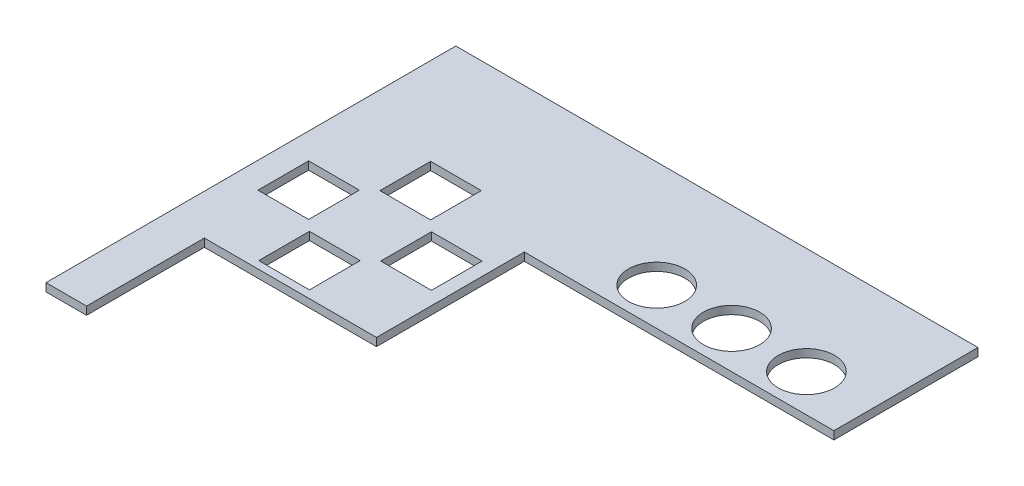
ISO-10303-21;
HEADER;
FILE_DESCRIPTION(('STEP AP214'),'2;1');
FILE_NAME('part.step','',(''),(''),'','','');
FILE_SCHEMA(('AUTOMOTIVE_DESIGN { 1 0 10303 214 1 1 1 1 }'));
ENDSEC;
DATA;
#1=APPLICATION_CONTEXT('core data for automotive mechanical design processes');
#2=APPLICATION_PROTOCOL_DEFINITION('international standard','automotive_design',2000,#1);
#3=PRODUCT_CONTEXT('',#1,'mechanical');
#4=PRODUCT('Part','Part','',(#3));
#5=PRODUCT_RELATED_PRODUCT_CATEGORY('part','',(#4));
#6=PRODUCT_DEFINITION_FORMATION('','',#4);
#7=PRODUCT_DEFINITION_CONTEXT('part definition',#1,'design');
#8=PRODUCT_DEFINITION('design','',#6,#7);
#9=PRODUCT_DEFINITION_SHAPE('','',#8);
#10=(LENGTH_UNIT() NAMED_UNIT(*) SI_UNIT(.MILLI.,.METRE.));
#11=(NAMED_UNIT(*) PLANE_ANGLE_UNIT() SI_UNIT($,.RADIAN.));
#12=(NAMED_UNIT(*) SI_UNIT($,.STERADIAN.) SOLID_ANGLE_UNIT());
#13=UNCERTAINTY_MEASURE_WITH_UNIT(LENGTH_MEASURE(1.E-05),#10,'distance_accuracy_value','');
#14=(GEOMETRIC_REPRESENTATION_CONTEXT(3) GLOBAL_UNCERTAINTY_ASSIGNED_CONTEXT((#13)) GLOBAL_UNIT_ASSIGNED_CONTEXT((#10,
#11,#12)) REPRESENTATION_CONTEXT('',''));
#15=CARTESIAN_POINT('',(0.,0.,0.));
#16=DIRECTION('',(0.,0.,1.));
#17=DIRECTION('',(1.,0.,0.));
#18=AXIS2_PLACEMENT_3D('',#15,#16,#17);
#19=CARTESIAN_POINT('',(-32.425,1.,25.45));
#20=DIRECTION('',(1.,0.,0.));
#21=DIRECTION('',(0.,0.,-1.));
#22=AXIS2_PLACEMENT_3D('',#19,#20,#21);
#23=PLANE('',#22);
#24=DIRECTION('',(0.,0.,1.));
#25=VECTOR('',#24,1.);
#26=CARTESIAN_POINT('',(-32.425,0.,25.45));
#27=LINE('',#26,#25);
#28=CARTESIAN_POINT('',(-32.425,0.,-25.45));
#29=VERTEX_POINT('',#28);
#30=CARTESIAN_POINT('',(-32.425,0.,25.45));
#31=VERTEX_POINT('',#30);
#32=EDGE_CURVE('E250',#29,#31,#27,.T.);
#33=ORIENTED_EDGE('',*,*,#32,.T.);
#34=DIRECTION('',(0.,-1.,0.));
#35=VECTOR('',#34,1.);
#36=CARTESIAN_POINT('',(-32.425,1.,25.45));
#37=LINE('',#36,#35);
#38=CARTESIAN_POINT('',(-32.425,1.,25.45));
#39=VERTEX_POINT('',#38);
#40=EDGE_CURVE('E234',#39,#31,#37,.T.);
#41=ORIENTED_EDGE('',*,*,#40,.F.);
#42=DIRECTION('',(0.,0.,1.));
#43=VECTOR('',#42,1.);
#44=CARTESIAN_POINT('',(-32.425,1.,25.45));
#45=LINE('',#44,#43);
#46=CARTESIAN_POINT('',(-32.425,1.,-25.45));
#47=VERTEX_POINT('',#46);
#48=EDGE_CURVE('E244',#47,#39,#45,.T.);
#49=ORIENTED_EDGE('',*,*,#48,.F.);
#50=DIRECTION('',(0.,-1.,0.));
#51=VECTOR('',#50,1.);
#52=CARTESIAN_POINT('',(-32.425,1.,-25.45));
#53=LINE('',#52,#51);
#54=EDGE_CURVE('E246',#47,#29,#53,.T.);
#55=ORIENTED_EDGE('',*,*,#54,.T.);
#56=EDGE_LOOP('',(#33,#41,#49,#55));
#57=FACE_BOUND('',#56,.T.);
#58=ADVANCED_FACE('F44',(#57),#23,.F.);
#59=CARTESIAN_POINT('',(32.425,1.,25.45));
#60=DIRECTION('',(0.,0.,-1.));
#61=DIRECTION('',(-1.,0.,0.));
#62=AXIS2_PLACEMENT_3D('',#59,#60,#61);
#63=PLANE('',#62);
#64=DIRECTION('',(1.,0.,0.));
#65=VECTOR('',#64,1.);
#66=CARTESIAN_POINT('',(32.425,0.,25.45));
#67=LINE('',#66,#65);
#68=CARTESIAN_POINT('',(-27.388628542421,0.,25.45));
#69=VERTEX_POINT('',#68);
#70=EDGE_CURVE('E239',#31,#69,#67,.T.);
#71=ORIENTED_EDGE('',*,*,#70,.T.);
#72=DIRECTION('',(0.,1.,0.));
#73=VECTOR('',#72,1.);
#74=CARTESIAN_POINT('',(-27.388628542421,-9.,25.45));
#75=LINE('',#74,#73);
#76=CARTESIAN_POINT('',(-27.388628542421,1.,25.45));
#77=VERTEX_POINT('',#76);
#78=EDGE_CURVE('E60',#69,#77,#75,.T.);
#79=ORIENTED_EDGE('',*,*,#78,.T.);
#80=DIRECTION('',(1.,0.,0.));
#81=VECTOR('',#80,1.);
#82=CARTESIAN_POINT('',(32.425,1.,25.45));
#83=LINE('',#82,#81);
#84=EDGE_CURVE('E271',#39,#77,#83,.T.);
#85=ORIENTED_EDGE('',*,*,#84,.F.);
#86=ORIENTED_EDGE('',*,*,#40,.T.);
#87=EDGE_LOOP('',(#71,#79,#85,#86));
#88=FACE_BOUND('',#87,.T.);
#89=ADVANCED_FACE('F526',(#88),#63,.F.);
#90=CARTESIAN_POINT('',(32.425,1.,25.45));
#91=DIRECTION('',(-1.,0.,0.));
#92=DIRECTION('',(0.,0.,1.));
#93=AXIS2_PLACEMENT_3D('',#90,#91,#92);
#94=PLANE('',#93);
#95=DIRECTION('',(0.,0.,-1.));
#96=VECTOR('',#95,1.);
#97=CARTESIAN_POINT('',(32.425,1.,25.45));
#98=LINE('',#97,#96);
#99=CARTESIAN_POINT('',(32.425,1.,-7.5498486793547));
#100=VERTEX_POINT('',#99);
#101=CARTESIAN_POINT('',(32.425,1.,-25.45));
#102=VERTEX_POINT('',#101);
#103=EDGE_CURVE('E267',#100,#102,#98,.T.);
#104=ORIENTED_EDGE('',*,*,#103,.F.);
#105=DIRECTION('',(0.,1.,0.));
#106=VECTOR('',#105,1.);
#107=CARTESIAN_POINT('',(32.425,-9.,-7.5498486793547));
#108=LINE('',#107,#106);
#109=CARTESIAN_POINT('',(32.425,0.,-7.5498486793547));
#110=VERTEX_POINT('',#109);
#111=EDGE_CURVE('E432',#110,#100,#108,.T.);
#112=ORIENTED_EDGE('',*,*,#111,.F.);
#113=DIRECTION('',(0.,0.,-1.));
#114=VECTOR('',#113,1.);
#115=CARTESIAN_POINT('',(32.425,0.,25.45));
#116=LINE('',#115,#114);
#117=CARTESIAN_POINT('',(32.425,0.,-25.45));
#118=VERTEX_POINT('',#117);
#119=EDGE_CURVE('E238',#110,#118,#116,.T.);
#120=ORIENTED_EDGE('',*,*,#119,.T.);
#121=DIRECTION('',(0.,-1.,0.));
#122=VECTOR('',#121,1.);
#123=CARTESIAN_POINT('',(32.425,1.,-25.45));
#124=LINE('',#123,#122);
#125=EDGE_CURVE('E240',#102,#118,#124,.T.);
#126=ORIENTED_EDGE('',*,*,#125,.F.);
#127=EDGE_LOOP('',(#104,#112,#120,#126));
#128=FACE_BOUND('',#127,.T.);
#129=ADVANCED_FACE('F515',(#128),#94,.F.);
#130=CARTESIAN_POINT('',(32.425,1.,-25.45));
#131=DIRECTION('',(0.,0.,1.));
#132=DIRECTION('',(1.,0.,0.));
#133=AXIS2_PLACEMENT_3D('',#130,#131,#132);
#134=PLANE('',#133);
#135=DIRECTION('',(-1.,0.,0.));
#136=VECTOR('',#135,1.);
#137=CARTESIAN_POINT('',(32.425,0.,-25.45));
#138=LINE('',#137,#136);
#139=EDGE_CURVE('E245',#118,#29,#138,.T.);
#140=ORIENTED_EDGE('',*,*,#139,.T.);
#141=ORIENTED_EDGE('',*,*,#54,.F.);
#142=DIRECTION('',(-1.,0.,0.));
#143=VECTOR('',#142,1.);
#144=CARTESIAN_POINT('',(32.425,1.,-25.45));
#145=LINE('',#144,#143);
#146=EDGE_CURVE('E166',#102,#47,#145,.T.);
#147=ORIENTED_EDGE('',*,*,#146,.F.);
#148=ORIENTED_EDGE('',*,*,#125,.T.);
#149=EDGE_LOOP('',(#140,#141,#147,#148));
#150=FACE_BOUND('',#149,.T.);
#151=ADVANCED_FACE('F520',(#150),#134,.F.);
#152=CARTESIAN_POINT('',(0.,1.,0.));
#153=DIRECTION('',(0.,1.,0.));
#154=DIRECTION('',(0.,0.,1.));
#155=AXIS2_PLACEMENT_3D('',#152,#153,#154);
#156=PLANE('',#155);
#157=DIRECTION('',(-1.,0.,0.));
#158=VECTOR('',#157,1.);
#159=CARTESIAN_POINT('',(-6.01373228139077,1.,-7.5498486793547));
#160=LINE('',#159,#158);
#161=CARTESIAN_POINT('',(-6.01373228139077,1.,-7.5498486793547));
#162=VERTEX_POINT('',#161);
#163=EDGE_CURVE('E429',#100,#162,#160,.T.);
#164=ORIENTED_EDGE('',*,*,#163,.F.);
#165=ORIENTED_EDGE('',*,*,#103,.T.);
#166=ORIENTED_EDGE('',*,*,#146,.T.);
#167=ORIENTED_EDGE('',*,*,#48,.T.);
#168=ORIENTED_EDGE('',*,*,#84,.T.);
#169=DIRECTION('',(0.,0.,1.));
#170=VECTOR('',#169,1.);
#171=CARTESIAN_POINT('',(-27.388628542421,1.,25.45));
#172=LINE('',#171,#170);
#173=CARTESIAN_POINT('',(-27.388628542421,1.,10.8181814409801));
#174=VERTEX_POINT('',#173);
#175=EDGE_CURVE('E498',#174,#77,#172,.T.);
#176=ORIENTED_EDGE('',*,*,#175,.F.);
#177=DIRECTION('',(-1.,0.,0.));
#178=VECTOR('',#177,1.);
#179=CARTESIAN_POINT('',(-27.388628542421,1.,10.8181814409801));
#180=LINE('',#179,#178);
#181=CARTESIAN_POINT('',(-6.01373228139077,1.,10.8181814409801));
#182=VERTEX_POINT('',#181);
#183=EDGE_CURVE('E501',#182,#174,#180,.T.);
#184=ORIENTED_EDGE('',*,*,#183,.F.);
#185=DIRECTION('',(0.,0.,1.));
#186=VECTOR('',#185,1.);
#187=CARTESIAN_POINT('',(-6.01373228139077,1.,10.8181814409801));
#188=LINE('',#187,#186);
#189=EDGE_CURVE('E447',#162,#182,#188,.T.);
#190=ORIENTED_EDGE('',*,*,#189,.F.);
#191=EDGE_LOOP('',(#164,#165,#166,#167,#168,#176,#184,#190));
#192=FACE_BOUND('',#191,.T.);
#193=CARTESIAN_POINT('',(5.76656416327977,1.,-12.2000878600459));
#194=DIRECTION('',(0.,1.,0.));
#195=DIRECTION('',(0.,0.,1.));
#196=AXIS2_PLACEMENT_3D('',#193,#194,#195);
#197=CIRCLE('',#196,3.5);
#198=CARTESIAN_POINT('',(5.76656416327977,1.,-8.70008786004591));
#199=VERTEX_POINT('',#198);
#200=EDGE_CURVE('E387',#199,#199,#197,.T.);
#201=ORIENTED_EDGE('',*,*,#200,.F.);
#202=EDGE_LOOP('',(#201));
#203=FACE_BOUND('',#202,.T.);
#204=CARTESIAN_POINT('',(15.0665641632798,1.,-12.2000878600459));
#205=DIRECTION('',(0.,1.,0.));
#206=DIRECTION('',(0.,0.,1.));
#207=AXIS2_PLACEMENT_3D('',#204,#205,#206);
#208=CIRCLE('',#207,3.5);
#209=CARTESIAN_POINT('',(15.0665641632798,1.,-8.7000878600459));
#210=VERTEX_POINT('',#209);
#211=EDGE_CURVE('E451',#210,#210,#208,.T.);
#212=ORIENTED_EDGE('',*,*,#211,.F.);
#213=EDGE_LOOP('',(#212));
#214=FACE_BOUND('',#213,.T.);
#215=CARTESIAN_POINT('',(24.3665641632798,1.,-12.2000878600459));
#216=DIRECTION('',(0.,1.,0.));
#217=DIRECTION('',(0.,0.,1.));
#218=AXIS2_PLACEMENT_3D('',#215,#216,#217);
#219=CIRCLE('',#218,3.5);
#220=CARTESIAN_POINT('',(24.3665641632798,1.,-8.70008786004591));
#221=VERTEX_POINT('',#220);
#222=EDGE_CURVE('E436',#221,#221,#219,.T.);
#223=ORIENTED_EDGE('',*,*,#222,.F.);
#224=EDGE_LOOP('',(#223));
#225=FACE_BOUND('',#224,.T.);
#226=DIRECTION('',(0.,0.,-1.));
#227=VECTOR('',#226,1.);
#228=CARTESIAN_POINT('',(-22.9117553955337,1.,-3.95516937937018));
#229=LINE('',#228,#227);
#230=CARTESIAN_POINT('',(-22.9117553955337,1.,2.34483062062982));
#231=VERTEX_POINT('',#230);
#232=CARTESIAN_POINT('',(-22.9117553955337,1.,-3.95516937937018));
#233=VERTEX_POINT('',#232);
#234=EDGE_CURVE('E175',#231,#233,#229,.T.);
#235=ORIENTED_EDGE('',*,*,#234,.F.);
#236=DIRECTION('',(1.,0.,0.));
#237=VECTOR('',#236,1.);
#238=CARTESIAN_POINT('',(-29.2117553955337,1.,2.34483062062982));
#239=LINE('',#238,#237);
#240=CARTESIAN_POINT('',(-29.2117553955337,1.,2.34483062062982));
#241=VERTEX_POINT('',#240);
#242=EDGE_CURVE('E174',#241,#231,#239,.T.);
#243=ORIENTED_EDGE('',*,*,#242,.F.);
#244=DIRECTION('',(0.,0.,1.));
#245=VECTOR('',#244,1.);
#246=CARTESIAN_POINT('',(-29.2117553955337,1.,-3.95516937937018));
#247=LINE('',#246,#245);
#248=CARTESIAN_POINT('',(-29.2117553955337,1.,-3.95516937937018));
#249=VERTEX_POINT('',#248);
#250=EDGE_CURVE('E171',#249,#241,#247,.T.);
#251=ORIENTED_EDGE('',*,*,#250,.F.);
#252=DIRECTION('',(-1.,0.,0.));
#253=VECTOR('',#252,1.);
#254=CARTESIAN_POINT('',(-29.2117553955337,1.,-3.95516937937018));
#255=LINE('',#254,#253);
#256=EDGE_CURVE('E367',#233,#249,#255,.T.);
#257=ORIENTED_EDGE('',*,*,#256,.F.);
#258=EDGE_LOOP('',(#235,#243,#251,#257));
#259=FACE_BOUND('',#258,.T.);
#260=DIRECTION('',(0.,0.,1.));
#261=VECTOR('',#260,1.);
#262=CARTESIAN_POINT('',(-21.5867553955337,1.,-5.18016937937018));
#263=LINE('',#262,#261);
#264=CARTESIAN_POINT('',(-21.5867553955337,1.,-11.4801693793702));
#265=VERTEX_POINT('',#264);
#266=CARTESIAN_POINT('',(-21.5867553955337,1.,-5.18016937937018));
#267=VERTEX_POINT('',#266);
#268=EDGE_CURVE('E336',#265,#267,#263,.T.);
#269=ORIENTED_EDGE('',*,*,#268,.F.);
#270=DIRECTION('',(-1.,0.,0.));
#271=VECTOR('',#270,1.);
#272=CARTESIAN_POINT('',(-21.5867553955337,1.,-11.4801693793702));
#273=LINE('',#272,#271);
#274=CARTESIAN_POINT('',(-15.2867553955337,1.,-11.4801693793702));
#275=VERTEX_POINT('',#274);
#276=EDGE_CURVE('E351',#275,#265,#273,.T.);
#277=ORIENTED_EDGE('',*,*,#276,.F.);
#278=DIRECTION('',(0.,0.,-1.));
#279=VECTOR('',#278,1.);
#280=CARTESIAN_POINT('',(-15.2867553955337,1.,-5.18016937937018));
#281=LINE('',#280,#279);
#282=CARTESIAN_POINT('',(-15.2867553955337,1.,-5.18016937937018));
#283=VERTEX_POINT('',#282);
#284=EDGE_CURVE('E346',#283,#275,#281,.T.);
#285=ORIENTED_EDGE('',*,*,#284,.F.);
#286=DIRECTION('',(1.,0.,0.));
#287=VECTOR('',#286,1.);
#288=CARTESIAN_POINT('',(-21.5867553955337,1.,-5.18016937937018));
#289=LINE('',#288,#287);
#290=EDGE_CURVE('E341',#267,#283,#289,.T.);
#291=ORIENTED_EDGE('',*,*,#290,.F.);
#292=EDGE_LOOP('',(#269,#277,#285,#291));
#293=FACE_BOUND('',#292,.T.);
#294=DIRECTION('',(0.,0.,-1.));
#295=VECTOR('',#294,1.);
#296=CARTESIAN_POINT('',(-7.66175539553367,1.,-3.95516937937018));
#297=LINE('',#296,#295);
#298=CARTESIAN_POINT('',(-7.66175539553367,1.,2.34483062062982));
#299=VERTEX_POINT('',#298);
#300=CARTESIAN_POINT('',(-7.66175539553367,1.,-3.95516937937018));
#301=VERTEX_POINT('',#300);
#302=EDGE_CURVE('E307',#299,#301,#297,.T.);
#303=ORIENTED_EDGE('',*,*,#302,.F.);
#304=DIRECTION('',(1.,0.,0.));
#305=VECTOR('',#304,1.);
#306=CARTESIAN_POINT('',(-7.66175539553367,1.,2.34483062062982));
#307=LINE('',#306,#305);
#308=CARTESIAN_POINT('',(-13.9617553955337,1.,2.34483062062982));
#309=VERTEX_POINT('',#308);
#310=EDGE_CURVE('E323',#309,#299,#307,.T.);
#311=ORIENTED_EDGE('',*,*,#310,.F.);
#312=DIRECTION('',(0.,0.,1.));
#313=VECTOR('',#312,1.);
#314=CARTESIAN_POINT('',(-13.9617553955337,1.,-3.95516937937018));
#315=LINE('',#314,#313);
#316=CARTESIAN_POINT('',(-13.9617553955337,1.,-3.95516937937018));
#317=VERTEX_POINT('',#316);
#318=EDGE_CURVE('E318',#317,#309,#315,.T.);
#319=ORIENTED_EDGE('',*,*,#318,.F.);
#320=DIRECTION('',(-1.,0.,0.));
#321=VECTOR('',#320,1.);
#322=CARTESIAN_POINT('',(-7.66175539553367,1.,-3.95516937937018));
#323=LINE('',#322,#321);
#324=EDGE_CURVE('E312',#301,#317,#323,.T.);
#325=ORIENTED_EDGE('',*,*,#324,.F.);
#326=EDGE_LOOP('',(#303,#311,#319,#325));
#327=FACE_BOUND('',#326,.T.);
#328=DIRECTION('',(0.,0.,1.));
#329=VECTOR('',#328,1.);
#330=CARTESIAN_POINT('',(-21.5867553955337,1.,3.56983062062983));
#331=LINE('',#330,#329);
#332=CARTESIAN_POINT('',(-21.5867553955337,1.,3.56983062062983));
#333=VERTEX_POINT('',#332);
#334=CARTESIAN_POINT('',(-21.5867553955337,1.,9.86983062062982));
#335=VERTEX_POINT('',#334);
#336=EDGE_CURVE('E278',#333,#335,#331,.T.);
#337=ORIENTED_EDGE('',*,*,#336,.F.);
#338=DIRECTION('',(-1.,0.,0.));
#339=VECTOR('',#338,1.);
#340=CARTESIAN_POINT('',(-21.5867553955337,1.,3.56983062062983));
#341=LINE('',#340,#339);
#342=CARTESIAN_POINT('',(-15.2867553955337,1.,3.56983062062982));
#343=VERTEX_POINT('',#342);
#344=EDGE_CURVE('E294',#343,#333,#341,.T.);
#345=ORIENTED_EDGE('',*,*,#344,.F.);
#346=DIRECTION('',(0.,0.,-1.));
#347=VECTOR('',#346,1.);
#348=CARTESIAN_POINT('',(-15.2867553955337,1.,3.56983062062982));
#349=LINE('',#348,#347);
#350=CARTESIAN_POINT('',(-15.2867553955337,1.,9.86983062062982));
#351=VERTEX_POINT('',#350);
#352=EDGE_CURVE('E289',#351,#343,#349,.T.);
#353=ORIENTED_EDGE('',*,*,#352,.F.);
#354=DIRECTION('',(1.,0.,0.));
#355=VECTOR('',#354,1.);
#356=CARTESIAN_POINT('',(-21.5867553955337,1.,9.86983062062982));
#357=LINE('',#356,#355);
#358=EDGE_CURVE('E283',#335,#351,#357,.T.);
#359=ORIENTED_EDGE('',*,*,#358,.F.);
#360=EDGE_LOOP('',(#337,#345,#353,#359));
#361=FACE_BOUND('',#360,.T.);
#362=ADVANCED_FACE('F46',(#192,#203,#214,#225,#259,#293,#327,#361),#156,.T.);
#363=CARTESIAN_POINT('',(0.,0.,0.));
#364=DIRECTION('',(0.,1.,0.));
#365=DIRECTION('',(0.,0.,1.));
#366=AXIS2_PLACEMENT_3D('',#363,#364,#365);
#367=PLANE('',#366);
#368=CARTESIAN_POINT('',(5.76656416327977,0.,-12.2000878600459));
#369=DIRECTION('',(0.,1.,0.));
#370=DIRECTION('',(0.,0.,1.));
#371=AXIS2_PLACEMENT_3D('',#368,#369,#370);
#372=CIRCLE('',#371,3.5);
#373=CARTESIAN_POINT('',(5.76656416327977,0.,-8.70008786004591));
#374=VERTEX_POINT('',#373);
#375=EDGE_CURVE('E263',#374,#374,#372,.T.);
#376=ORIENTED_EDGE('',*,*,#375,.T.);
#377=EDGE_LOOP('',(#376));
#378=FACE_BOUND('',#377,.T.);
#379=CARTESIAN_POINT('',(15.0665641632798,0.,-12.2000878600459));
#380=DIRECTION('',(0.,1.,0.));
#381=DIRECTION('',(0.,0.,1.));
#382=AXIS2_PLACEMENT_3D('',#379,#380,#381);
#383=CIRCLE('',#382,3.5);
#384=CARTESIAN_POINT('',(15.0665641632798,0.,-8.7000878600459));
#385=VERTEX_POINT('',#384);
#386=EDGE_CURVE('E386',#385,#385,#383,.T.);
#387=ORIENTED_EDGE('',*,*,#386,.T.);
#388=EDGE_LOOP('',(#387));
#389=FACE_BOUND('',#388,.T.);
#390=CARTESIAN_POINT('',(24.3665641632798,0.,-12.2000878600459));
#391=DIRECTION('',(0.,1.,0.));
#392=DIRECTION('',(0.,0.,1.));
#393=AXIS2_PLACEMENT_3D('',#390,#391,#392);
#394=CIRCLE('',#393,3.5);
#395=CARTESIAN_POINT('',(24.3665641632798,0.,-8.70008786004591));
#396=VERTEX_POINT('',#395);
#397=EDGE_CURVE('E382',#396,#396,#394,.T.);
#398=ORIENTED_EDGE('',*,*,#397,.T.);
#399=EDGE_LOOP('',(#398));
#400=FACE_BOUND('',#399,.T.);
#401=DIRECTION('',(1.,0.,0.));
#402=VECTOR('',#401,1.);
#403=CARTESIAN_POINT('',(0.,0.,2.34483062062982));
#404=LINE('',#403,#402);
#405=CARTESIAN_POINT('',(-29.2117553955337,0.,2.34483062062982));
#406=VERTEX_POINT('',#405);
#407=CARTESIAN_POINT('',(-22.9117553955337,0.,2.34483062062982));
#408=VERTEX_POINT('',#407);
#409=EDGE_CURVE('E155',#406,#408,#404,.T.);
#410=ORIENTED_EDGE('',*,*,#409,.T.);
#411=DIRECTION('',(0.,0.,-1.));
#412=VECTOR('',#411,1.);
#413=CARTESIAN_POINT('',(-22.9117553955337,0.,0.));
#414=LINE('',#413,#412);
#415=CARTESIAN_POINT('',(-22.9117553955337,0.,-3.95516937937018));
#416=VERTEX_POINT('',#415);
#417=EDGE_CURVE('E165',#408,#416,#414,.T.);
#418=ORIENTED_EDGE('',*,*,#417,.T.);
#419=DIRECTION('',(-1.,0.,0.));
#420=VECTOR('',#419,1.);
#421=CARTESIAN_POINT('',(0.,0.,-3.95516937937018));
#422=LINE('',#421,#420);
#423=CARTESIAN_POINT('',(-29.2117553955337,0.,-3.95516937937018));
#424=VERTEX_POINT('',#423);
#425=EDGE_CURVE('E69',#416,#424,#422,.T.);
#426=ORIENTED_EDGE('',*,*,#425,.T.);
#427=DIRECTION('',(0.,0.,1.));
#428=VECTOR('',#427,1.);
#429=CARTESIAN_POINT('',(-29.2117553955337,0.,0.));
#430=LINE('',#429,#428);
#431=EDGE_CURVE('E169',#424,#406,#430,.T.);
#432=ORIENTED_EDGE('',*,*,#431,.T.);
#433=EDGE_LOOP('',(#410,#418,#426,#432));
#434=FACE_BOUND('',#433,.T.);
#435=DIRECTION('',(-1.,0.,0.));
#436=VECTOR('',#435,1.);
#437=CARTESIAN_POINT('',(0.,0.,-11.4801693793702));
#438=LINE('',#437,#436);
#439=CARTESIAN_POINT('',(-15.2867553955337,0.,-11.4801693793702));
#440=VERTEX_POINT('',#439);
#441=CARTESIAN_POINT('',(-21.5867553955337,0.,-11.4801693793702));
#442=VERTEX_POINT('',#441);
#443=EDGE_CURVE('E180',#440,#442,#438,.T.);
#444=ORIENTED_EDGE('',*,*,#443,.T.);
#445=DIRECTION('',(0.,0.,1.));
#446=VECTOR('',#445,1.);
#447=CARTESIAN_POINT('',(-21.5867553955337,0.,0.));
#448=LINE('',#447,#446);
#449=CARTESIAN_POINT('',(-21.5867553955337,0.,-5.18016937937018));
#450=VERTEX_POINT('',#449);
#451=EDGE_CURVE('E185',#442,#450,#448,.T.);
#452=ORIENTED_EDGE('',*,*,#451,.T.);
#453=DIRECTION('',(1.,0.,0.));
#454=VECTOR('',#453,1.);
#455=CARTESIAN_POINT('',(0.,0.,-5.18016937937019));
#456=LINE('',#455,#454);
#457=CARTESIAN_POINT('',(-15.2867553955337,0.,-5.18016937937018));
#458=VERTEX_POINT('',#457);
#459=EDGE_CURVE('E192',#450,#458,#456,.T.);
#460=ORIENTED_EDGE('',*,*,#459,.T.);
#461=DIRECTION('',(0.,0.,-1.));
#462=VECTOR('',#461,1.);
#463=CARTESIAN_POINT('',(-15.2867553955337,0.,0.));
#464=LINE('',#463,#462);
#465=EDGE_CURVE('E194',#458,#440,#464,.T.);
#466=ORIENTED_EDGE('',*,*,#465,.T.);
#467=EDGE_LOOP('',(#444,#452,#460,#466));
#468=FACE_BOUND('',#467,.T.);
#469=DIRECTION('',(1.,0.,0.));
#470=VECTOR('',#469,1.);
#471=CARTESIAN_POINT('',(0.,0.,2.34483062062982));
#472=LINE('',#471,#470);
#473=CARTESIAN_POINT('',(-13.9617553955337,0.,2.34483062062982));
#474=VERTEX_POINT('',#473);
#475=CARTESIAN_POINT('',(-7.66175539553367,0.,2.34483062062982));
#476=VERTEX_POINT('',#475);
#477=EDGE_CURVE('E198',#474,#476,#472,.T.);
#478=ORIENTED_EDGE('',*,*,#477,.T.);
#479=DIRECTION('',(0.,0.,-1.));
#480=VECTOR('',#479,1.);
#481=CARTESIAN_POINT('',(-7.66175539553367,0.,0.));
#482=LINE('',#481,#480);
#483=CARTESIAN_POINT('',(-7.66175539553367,0.,-3.95516937937018));
#484=VERTEX_POINT('',#483);
#485=EDGE_CURVE('E202',#476,#484,#482,.T.);
#486=ORIENTED_EDGE('',*,*,#485,.T.);
#487=DIRECTION('',(-1.,0.,0.));
#488=VECTOR('',#487,1.);
#489=CARTESIAN_POINT('',(0.,0.,-3.95516937937018));
#490=LINE('',#489,#488);
#491=CARTESIAN_POINT('',(-13.9617553955337,0.,-3.95516937937018));
#492=VERTEX_POINT('',#491);
#493=EDGE_CURVE('E206',#484,#492,#490,.T.);
#494=ORIENTED_EDGE('',*,*,#493,.T.);
#495=DIRECTION('',(0.,0.,1.));
#496=VECTOR('',#495,1.);
#497=CARTESIAN_POINT('',(-13.9617553955337,0.,0.));
#498=LINE('',#497,#496);
#499=EDGE_CURVE('E210',#492,#474,#498,.T.);
#500=ORIENTED_EDGE('',*,*,#499,.T.);
#501=EDGE_LOOP('',(#478,#486,#494,#500));
#502=FACE_BOUND('',#501,.T.);
#503=DIRECTION('',(-1.,0.,0.));
#504=VECTOR('',#503,1.);
#505=CARTESIAN_POINT('',(0.,0.,3.5698306206298));
#506=LINE('',#505,#504);
#507=CARTESIAN_POINT('',(-15.2867553955337,0.,3.56983062062982));
#508=VERTEX_POINT('',#507);
#509=CARTESIAN_POINT('',(-21.5867553955337,0.,3.56983062062983));
#510=VERTEX_POINT('',#509);
#511=EDGE_CURVE('E214',#508,#510,#506,.T.);
#512=ORIENTED_EDGE('',*,*,#511,.T.);
#513=DIRECTION('',(0.,0.,1.));
#514=VECTOR('',#513,1.);
#515=CARTESIAN_POINT('',(-21.5867553955337,0.,0.));
#516=LINE('',#515,#514);
#517=CARTESIAN_POINT('',(-21.5867553955337,0.,9.86983062062982));
#518=VERTEX_POINT('',#517);
#519=EDGE_CURVE('E218',#510,#518,#516,.T.);
#520=ORIENTED_EDGE('',*,*,#519,.T.);
#521=DIRECTION('',(1.,0.,0.));
#522=VECTOR('',#521,1.);
#523=CARTESIAN_POINT('',(0.,0.,9.86983062062982));
#524=LINE('',#523,#522);
#525=CARTESIAN_POINT('',(-15.2867553955337,0.,9.86983062062982));
#526=VERTEX_POINT('',#525);
#527=EDGE_CURVE('E222',#518,#526,#524,.T.);
#528=ORIENTED_EDGE('',*,*,#527,.T.);
#529=DIRECTION('',(0.,0.,-1.));
#530=VECTOR('',#529,1.);
#531=CARTESIAN_POINT('',(-15.2867553955337,0.,0.));
#532=LINE('',#531,#530);
#533=EDGE_CURVE('E226',#526,#508,#532,.T.);
#534=ORIENTED_EDGE('',*,*,#533,.T.);
#535=EDGE_LOOP('',(#512,#520,#528,#534));
#536=FACE_BOUND('',#535,.T.);
#537=ORIENTED_EDGE('',*,*,#119,.F.);
#538=DIRECTION('',(-1.,0.,0.));
#539=VECTOR('',#538,1.);
#540=CARTESIAN_POINT('',(0.,0.,-7.5498486793547));
#541=LINE('',#540,#539);
#542=CARTESIAN_POINT('',(-6.01373228139077,0.,-7.5498486793547));
#543=VERTEX_POINT('',#542);
#544=EDGE_CURVE('E11',#110,#543,#541,.T.);
#545=ORIENTED_EDGE('',*,*,#544,.T.);
#546=DIRECTION('',(0.,0.,1.));
#547=VECTOR('',#546,1.);
#548=CARTESIAN_POINT('',(-6.01373228139077,0.,0.));
#549=LINE('',#548,#547);
#550=CARTESIAN_POINT('',(-6.01373228139077,0.,10.8181814409801));
#551=VERTEX_POINT('',#550);
#552=EDGE_CURVE('E53',#543,#551,#549,.T.);
#553=ORIENTED_EDGE('',*,*,#552,.T.);
#554=DIRECTION('',(-1.,0.,0.));
#555=VECTOR('',#554,1.);
#556=CARTESIAN_POINT('',(0.,0.,10.8181814409801));
#557=LINE('',#556,#555);
#558=CARTESIAN_POINT('',(-27.388628542421,0.,10.8181814409801));
#559=VERTEX_POINT('',#558);
#560=EDGE_CURVE('E396',#551,#559,#557,.T.);
#561=ORIENTED_EDGE('',*,*,#560,.T.);
#562=DIRECTION('',(0.,0.,1.));
#563=VECTOR('',#562,1.);
#564=CARTESIAN_POINT('',(-27.388628542421,0.,0.));
#565=LINE('',#564,#563);
#566=EDGE_CURVE('E378',#559,#69,#565,.T.);
#567=ORIENTED_EDGE('',*,*,#566,.T.);
#568=ORIENTED_EDGE('',*,*,#70,.F.);
#569=ORIENTED_EDGE('',*,*,#32,.F.);
#570=ORIENTED_EDGE('',*,*,#139,.F.);
#571=EDGE_LOOP('',(#537,#545,#553,#561,#567,#568,#569,#570));
#572=FACE_BOUND('',#571,.T.);
#573=ADVANCED_FACE('F177',(#378,#389,#400,#434,#468,#502,#536,#572),#367,.F.);
#574=CARTESIAN_POINT('',(-21.5867553955337,-9.,3.56983062062983));
#575=DIRECTION('',(-1.,0.,0.));
#576=DIRECTION('',(0.,0.,1.));
#577=AXIS2_PLACEMENT_3D('',#574,#575,#576);
#578=PLANE('',#577);
#579=DIRECTION('',(0.,1.,0.));
#580=VECTOR('',#579,1.);
#581=CARTESIAN_POINT('',(-21.5867553955337,-9.,3.56983062062983));
#582=LINE('',#581,#580);
#583=EDGE_CURVE('E230',#510,#333,#582,.T.);
#584=ORIENTED_EDGE('',*,*,#583,.T.);
#585=ORIENTED_EDGE('',*,*,#336,.T.);
#586=DIRECTION('',(0.,1.,0.));
#587=VECTOR('',#586,1.);
#588=CARTESIAN_POINT('',(-21.5867553955337,-9.,9.86983062062982));
#589=LINE('',#588,#587);
#590=EDGE_CURVE('E288',#518,#335,#589,.T.);
#591=ORIENTED_EDGE('',*,*,#590,.F.);
#592=ORIENTED_EDGE('',*,*,#519,.F.);
#593=EDGE_LOOP('',(#584,#585,#591,#592));
#594=FACE_BOUND('',#593,.T.);
#595=ADVANCED_FACE('F544',(#594),#578,.F.);
#596=CARTESIAN_POINT('',(-21.5867553955337,-9.,3.56983062062983));
#597=DIRECTION('',(0.,0.,-1.));
#598=DIRECTION('',(-1.,0.,0.));
#599=AXIS2_PLACEMENT_3D('',#596,#597,#598);
#600=PLANE('',#599);
#601=DIRECTION('',(0.,1.,0.));
#602=VECTOR('',#601,1.);
#603=CARTESIAN_POINT('',(-15.2867553955337,-9.,3.56983062062982));
#604=LINE('',#603,#602);
#605=EDGE_CURVE('E282',#508,#343,#604,.T.);
#606=ORIENTED_EDGE('',*,*,#605,.T.);
#607=ORIENTED_EDGE('',*,*,#344,.T.);
#608=ORIENTED_EDGE('',*,*,#583,.F.);
#609=ORIENTED_EDGE('',*,*,#511,.F.);
#610=EDGE_LOOP('',(#606,#607,#608,#609));
#611=FACE_BOUND('',#610,.T.);
#612=ADVANCED_FACE('F540',(#611),#600,.F.);
#613=CARTESIAN_POINT('',(-15.2867553955337,-9.,3.56983062062982));
#614=DIRECTION('',(1.,0.,0.));
#615=DIRECTION('',(0.,0.,-1.));
#616=AXIS2_PLACEMENT_3D('',#613,#614,#615);
#617=PLANE('',#616);
#618=DIRECTION('',(0.,1.,0.));
#619=VECTOR('',#618,1.);
#620=CARTESIAN_POINT('',(-15.2867553955337,-9.,9.86983062062982));
#621=LINE('',#620,#619);
#622=EDGE_CURVE('E293',#526,#351,#621,.T.);
#623=ORIENTED_EDGE('',*,*,#622,.T.);
#624=ORIENTED_EDGE('',*,*,#352,.T.);
#625=ORIENTED_EDGE('',*,*,#605,.F.);
#626=ORIENTED_EDGE('',*,*,#533,.F.);
#627=EDGE_LOOP('',(#623,#624,#625,#626));
#628=FACE_BOUND('',#627,.T.);
#629=ADVANCED_FACE('F543',(#628),#617,.F.);
#630=CARTESIAN_POINT('',(-21.5867553955337,-9.,9.86983062062982));
#631=DIRECTION('',(0.,0.,1.));
#632=DIRECTION('',(1.,0.,0.));
#633=AXIS2_PLACEMENT_3D('',#630,#631,#632);
#634=PLANE('',#633);
#635=ORIENTED_EDGE('',*,*,#590,.T.);
#636=ORIENTED_EDGE('',*,*,#358,.T.);
#637=ORIENTED_EDGE('',*,*,#622,.F.);
#638=ORIENTED_EDGE('',*,*,#527,.F.);
#639=EDGE_LOOP('',(#635,#636,#637,#638));
#640=FACE_BOUND('',#639,.T.);
#641=ADVANCED_FACE('F548',(#640),#634,.F.);
#642=CARTESIAN_POINT('',(-7.66175539553367,-9.,-3.95516937937018));
#643=DIRECTION('',(1.,0.,0.));
#644=DIRECTION('',(0.,0.,-1.));
#645=AXIS2_PLACEMENT_3D('',#642,#643,#644);
#646=PLANE('',#645);
#647=DIRECTION('',(0.,1.,0.));
#648=VECTOR('',#647,1.);
#649=CARTESIAN_POINT('',(-7.66175539553367,-9.,2.34483062062982));
#650=LINE('',#649,#648);
#651=EDGE_CURVE('E287',#476,#299,#650,.T.);
#652=ORIENTED_EDGE('',*,*,#651,.T.);
#653=ORIENTED_EDGE('',*,*,#302,.T.);
#654=DIRECTION('',(0.,1.,0.));
#655=VECTOR('',#654,1.);
#656=CARTESIAN_POINT('',(-7.66175539553367,-9.,-3.95516937937018));
#657=LINE('',#656,#655);
#658=EDGE_CURVE('E317',#484,#301,#657,.T.);
#659=ORIENTED_EDGE('',*,*,#658,.F.);
#660=ORIENTED_EDGE('',*,*,#485,.F.);
#661=EDGE_LOOP('',(#652,#653,#659,#660));
#662=FACE_BOUND('',#661,.T.);
#663=ADVANCED_FACE('F552',(#662),#646,.F.);
#664=CARTESIAN_POINT('',(-7.66175539553367,-9.,2.34483062062982));
#665=DIRECTION('',(0.,0.,1.));
#666=DIRECTION('',(1.,0.,0.));
#667=AXIS2_PLACEMENT_3D('',#664,#665,#666);
#668=PLANE('',#667);
#669=DIRECTION('',(0.,1.,0.));
#670=VECTOR('',#669,1.);
#671=CARTESIAN_POINT('',(-13.9617553955337,-9.,2.34483062062982));
#672=LINE('',#671,#670);
#673=EDGE_CURVE('E311',#474,#309,#672,.T.);
#674=ORIENTED_EDGE('',*,*,#673,.T.);
#675=ORIENTED_EDGE('',*,*,#310,.T.);
#676=ORIENTED_EDGE('',*,*,#651,.F.);
#677=ORIENTED_EDGE('',*,*,#477,.F.);
#678=EDGE_LOOP('',(#674,#675,#676,#677));
#679=FACE_BOUND('',#678,.T.);
#680=ADVANCED_FACE('F557',(#679),#668,.F.);
#681=CARTESIAN_POINT('',(-13.9617553955337,-9.,-3.95516937937018));
#682=DIRECTION('',(-1.,0.,0.));
#683=DIRECTION('',(0.,0.,1.));
#684=AXIS2_PLACEMENT_3D('',#681,#682,#683);
#685=PLANE('',#684);
#686=DIRECTION('',(0.,1.,0.));
#687=VECTOR('',#686,1.);
#688=CARTESIAN_POINT('',(-13.9617553955337,-9.,-3.95516937937018));
#689=LINE('',#688,#687);
#690=EDGE_CURVE('E322',#492,#317,#689,.T.);
#691=ORIENTED_EDGE('',*,*,#690,.T.);
#692=ORIENTED_EDGE('',*,*,#318,.T.);
#693=ORIENTED_EDGE('',*,*,#673,.F.);
#694=ORIENTED_EDGE('',*,*,#499,.F.);
#695=EDGE_LOOP('',(#691,#692,#693,#694));
#696=FACE_BOUND('',#695,.T.);
#697=ADVANCED_FACE('F560',(#696),#685,.F.);
#698=CARTESIAN_POINT('',(-7.66175539553367,-9.,-3.95516937937018));
#699=DIRECTION('',(0.,0.,-1.));
#700=DIRECTION('',(-1.,0.,0.));
#701=AXIS2_PLACEMENT_3D('',#698,#699,#700);
#702=PLANE('',#701);
#703=ORIENTED_EDGE('',*,*,#658,.T.);
#704=ORIENTED_EDGE('',*,*,#324,.T.);
#705=ORIENTED_EDGE('',*,*,#690,.F.);
#706=ORIENTED_EDGE('',*,*,#493,.F.);
#707=EDGE_LOOP('',(#703,#704,#705,#706));
#708=FACE_BOUND('',#707,.T.);
#709=ADVANCED_FACE('F564',(#708),#702,.F.);
#710=CARTESIAN_POINT('',(-21.5867553955337,-9.,-5.18016937937018));
#711=DIRECTION('',(-1.,0.,0.));
#712=DIRECTION('',(0.,0.,1.));
#713=AXIS2_PLACEMENT_3D('',#710,#711,#712);
#714=PLANE('',#713);
#715=DIRECTION('',(0.,1.,0.));
#716=VECTOR('',#715,1.);
#717=CARTESIAN_POINT('',(-21.5867553955337,-9.,-11.4801693793702));
#718=LINE('',#717,#716);
#719=EDGE_CURVE('E316',#442,#265,#718,.T.);
#720=ORIENTED_EDGE('',*,*,#719,.T.);
#721=ORIENTED_EDGE('',*,*,#268,.T.);
#722=DIRECTION('',(0.,1.,0.));
#723=VECTOR('',#722,1.);
#724=CARTESIAN_POINT('',(-21.5867553955337,-9.,-5.18016937937018));
#725=LINE('',#724,#723);
#726=EDGE_CURVE('E345',#450,#267,#725,.T.);
#727=ORIENTED_EDGE('',*,*,#726,.F.);
#728=ORIENTED_EDGE('',*,*,#451,.F.);
#729=EDGE_LOOP('',(#720,#721,#727,#728));
#730=FACE_BOUND('',#729,.T.);
#731=ADVANCED_FACE('F568',(#730),#714,.F.);
#732=CARTESIAN_POINT('',(-21.5867553955337,-9.,-11.4801693793702));
#733=DIRECTION('',(0.,0.,-1.));
#734=DIRECTION('',(-1.,0.,0.));
#735=AXIS2_PLACEMENT_3D('',#732,#733,#734);
#736=PLANE('',#735);
#737=DIRECTION('',(0.,1.,0.));
#738=VECTOR('',#737,1.);
#739=CARTESIAN_POINT('',(-15.2867553955337,-9.,-11.4801693793702));
#740=LINE('',#739,#738);
#741=EDGE_CURVE('E340',#440,#275,#740,.T.);
#742=ORIENTED_EDGE('',*,*,#741,.T.);
#743=ORIENTED_EDGE('',*,*,#276,.T.);
#744=ORIENTED_EDGE('',*,*,#719,.F.);
#745=ORIENTED_EDGE('',*,*,#443,.F.);
#746=EDGE_LOOP('',(#742,#743,#744,#745));
#747=FACE_BOUND('',#746,.T.);
#748=ADVANCED_FACE('F573',(#747),#736,.F.);
#749=CARTESIAN_POINT('',(-15.2867553955337,-9.,-5.18016937937018));
#750=DIRECTION('',(1.,0.,0.));
#751=DIRECTION('',(0.,0.,-1.));
#752=AXIS2_PLACEMENT_3D('',#749,#750,#751);
#753=PLANE('',#752);
#754=DIRECTION('',(0.,1.,0.));
#755=VECTOR('',#754,1.);
#756=CARTESIAN_POINT('',(-15.2867553955337,-9.,-5.18016937937018));
#757=LINE('',#756,#755);
#758=EDGE_CURVE('E350',#458,#283,#757,.T.);
#759=ORIENTED_EDGE('',*,*,#758,.T.);
#760=ORIENTED_EDGE('',*,*,#284,.T.);
#761=ORIENTED_EDGE('',*,*,#741,.F.);
#762=ORIENTED_EDGE('',*,*,#465,.F.);
#763=EDGE_LOOP('',(#759,#760,#761,#762));
#764=FACE_BOUND('',#763,.T.);
#765=ADVANCED_FACE('F576',(#764),#753,.F.);
#766=CARTESIAN_POINT('',(-21.5867553955337,-9.,-5.18016937937018));
#767=DIRECTION('',(0.,0.,1.));
#768=DIRECTION('',(1.,0.,0.));
#769=AXIS2_PLACEMENT_3D('',#766,#767,#768);
#770=PLANE('',#769);
#771=ORIENTED_EDGE('',*,*,#726,.T.);
#772=ORIENTED_EDGE('',*,*,#290,.T.);
#773=ORIENTED_EDGE('',*,*,#758,.F.);
#774=ORIENTED_EDGE('',*,*,#459,.F.);
#775=EDGE_LOOP('',(#771,#772,#773,#774));
#776=FACE_BOUND('',#775,.T.);
#777=ADVANCED_FACE('F580',(#776),#770,.F.);
#778=CARTESIAN_POINT('',(-22.9117553955337,-9.,-3.95516937937018));
#779=DIRECTION('',(1.,0.,0.));
#780=DIRECTION('',(0.,0.,-1.));
#781=AXIS2_PLACEMENT_3D('',#778,#779,#780);
#782=PLANE('',#781);
#783=DIRECTION('',(0.,1.,0.));
#784=VECTOR('',#783,1.);
#785=CARTESIAN_POINT('',(-22.9117553955337,-9.,2.34483062062982));
#786=LINE('',#785,#784);
#787=EDGE_CURVE('E160',#408,#231,#786,.T.);
#788=ORIENTED_EDGE('',*,*,#787,.T.);
#789=ORIENTED_EDGE('',*,*,#234,.T.);
#790=DIRECTION('',(0.,1.,0.));
#791=VECTOR('',#790,1.);
#792=CARTESIAN_POINT('',(-22.9117553955337,-9.,-3.95516937937018));
#793=LINE('',#792,#791);
#794=EDGE_CURVE('E364',#416,#233,#793,.T.);
#795=ORIENTED_EDGE('',*,*,#794,.F.);
#796=ORIENTED_EDGE('',*,*,#417,.F.);
#797=EDGE_LOOP('',(#788,#789,#795,#796));
#798=FACE_BOUND('',#797,.T.);
#799=ADVANCED_FACE('F460',(#798),#782,.F.);
#800=CARTESIAN_POINT('',(-29.2117553955337,-9.,2.34483062062982));
#801=DIRECTION('',(0.,0.,1.));
#802=DIRECTION('',(1.,0.,0.));
#803=AXIS2_PLACEMENT_3D('',#800,#801,#802);
#804=PLANE('',#803);
#805=DIRECTION('',(0.,1.,0.));
#806=VECTOR('',#805,1.);
#807=CARTESIAN_POINT('',(-29.2117553955337,-9.,2.34483062062982));
#808=LINE('',#807,#806);
#809=EDGE_CURVE('E159',#406,#241,#808,.T.);
#810=ORIENTED_EDGE('',*,*,#809,.T.);
#811=ORIENTED_EDGE('',*,*,#242,.T.);
#812=ORIENTED_EDGE('',*,*,#787,.F.);
#813=ORIENTED_EDGE('',*,*,#409,.F.);
#814=EDGE_LOOP('',(#810,#811,#812,#813));
#815=FACE_BOUND('',#814,.T.);
#816=ADVANCED_FACE('F157',(#815),#804,.F.);
#817=CARTESIAN_POINT('',(-29.2117553955337,-9.,-3.95516937937018));
#818=DIRECTION('',(-1.,0.,0.));
#819=DIRECTION('',(0.,0.,1.));
#820=AXIS2_PLACEMENT_3D('',#817,#818,#819);
#821=PLANE('',#820);
#822=DIRECTION('',(0.,1.,0.));
#823=VECTOR('',#822,1.);
#824=CARTESIAN_POINT('',(-29.2117553955337,-9.,-3.95516937937018));
#825=LINE('',#824,#823);
#826=EDGE_CURVE('E149',#424,#249,#825,.T.);
#827=ORIENTED_EDGE('',*,*,#826,.T.);
#828=ORIENTED_EDGE('',*,*,#250,.T.);
#829=ORIENTED_EDGE('',*,*,#809,.F.);
#830=ORIENTED_EDGE('',*,*,#431,.F.);
#831=EDGE_LOOP('',(#827,#828,#829,#830));
#832=FACE_BOUND('',#831,.T.);
#833=ADVANCED_FACE('F168',(#832),#821,.F.);
#834=CARTESIAN_POINT('',(-29.2117553955337,-9.,-3.95516937937018));
#835=DIRECTION('',(0.,0.,-1.));
#836=DIRECTION('',(-1.,0.,0.));
#837=AXIS2_PLACEMENT_3D('',#834,#835,#836);
#838=PLANE('',#837);
#839=ORIENTED_EDGE('',*,*,#794,.T.);
#840=ORIENTED_EDGE('',*,*,#256,.T.);
#841=ORIENTED_EDGE('',*,*,#826,.F.);
#842=ORIENTED_EDGE('',*,*,#425,.F.);
#843=EDGE_LOOP('',(#839,#840,#841,#842));
#844=FACE_BOUND('',#843,.T.);
#845=ADVANCED_FACE('F590',(#844),#838,.F.);
#846=CARTESIAN_POINT('',(24.3665641632798,-9.,-12.2000878600459));
#847=DIRECTION('',(0.,1.,0.));
#848=DIRECTION('',(0.,0.,1.));
#849=AXIS2_PLACEMENT_3D('',#846,#847,#848);
#850=CYLINDRICAL_SURFACE('',#849,3.5);
#851=ORIENTED_EDGE('',*,*,#222,.T.);
#852=EDGE_LOOP('',(#851));
#853=FACE_BOUND('',#852,.T.);
#854=ORIENTED_EDGE('',*,*,#397,.F.);
#855=EDGE_LOOP('',(#854));
#856=FACE_BOUND('',#855,.T.);
#857=ADVANCED_FACE('F593',(#853,#856),#850,.F.);
#858=CARTESIAN_POINT('',(15.0665641632798,-9.,-12.2000878600459));
#859=DIRECTION('',(0.,1.,0.));
#860=DIRECTION('',(0.,0.,1.));
#861=AXIS2_PLACEMENT_3D('',#858,#859,#860);
#862=CYLINDRICAL_SURFACE('',#861,3.5);
#863=ORIENTED_EDGE('',*,*,#211,.T.);
#864=EDGE_LOOP('',(#863));
#865=FACE_BOUND('',#864,.T.);
#866=ORIENTED_EDGE('',*,*,#386,.F.);
#867=EDGE_LOOP('',(#866));
#868=FACE_BOUND('',#867,.T.);
#869=ADVANCED_FACE('F610',(#865,#868),#862,.F.);
#870=CARTESIAN_POINT('',(5.76656416327977,-9.,-12.2000878600459));
#871=DIRECTION('',(0.,1.,0.));
#872=DIRECTION('',(0.,0.,1.));
#873=AXIS2_PLACEMENT_3D('',#870,#871,#872);
#874=CYLINDRICAL_SURFACE('',#873,3.5);
#875=ORIENTED_EDGE('',*,*,#200,.T.);
#876=EDGE_LOOP('',(#875));
#877=FACE_BOUND('',#876,.T.);
#878=ORIENTED_EDGE('',*,*,#375,.F.);
#879=EDGE_LOOP('',(#878));
#880=FACE_BOUND('',#879,.T.);
#881=ADVANCED_FACE('F615',(#877,#880),#874,.F.);
#882=CARTESIAN_POINT('',(-27.388628542421,-9.,10.8181814409801));
#883=DIRECTION('',(0.,0.,-1.));
#884=DIRECTION('',(-1.,0.,0.));
#885=AXIS2_PLACEMENT_3D('',#882,#883,#884);
#886=PLANE('',#885);
#887=DIRECTION('',(0.,1.,0.));
#888=VECTOR('',#887,1.);
#889=CARTESIAN_POINT('',(-6.01373228139077,-9.,10.8181814409801));
#890=LINE('',#889,#888);
#891=EDGE_CURVE('E421',#551,#182,#890,.T.);
#892=ORIENTED_EDGE('',*,*,#891,.T.);
#893=ORIENTED_EDGE('',*,*,#183,.T.);
#894=DIRECTION('',(0.,1.,0.));
#895=VECTOR('',#894,1.);
#896=CARTESIAN_POINT('',(-27.388628542421,-9.,10.8181814409801));
#897=LINE('',#896,#895);
#898=EDGE_CURVE('E443',#559,#174,#897,.T.);
#899=ORIENTED_EDGE('',*,*,#898,.F.);
#900=ORIENTED_EDGE('',*,*,#560,.F.);
#901=EDGE_LOOP('',(#892,#893,#899,#900));
#902=FACE_BOUND('',#901,.T.);
#903=ADVANCED_FACE('F502',(#902),#886,.F.);
#904=CARTESIAN_POINT('',(-6.01373228139077,-9.,10.8181814409801));
#905=DIRECTION('',(-1.,0.,0.));
#906=DIRECTION('',(0.,0.,1.));
#907=AXIS2_PLACEMENT_3D('',#904,#905,#906);
#908=PLANE('',#907);
#909=DIRECTION('',(0.,1.,0.));
#910=VECTOR('',#909,1.);
#911=CARTESIAN_POINT('',(-6.01373228139077,-9.,-7.5498486793547));
#912=LINE('',#911,#910);
#913=EDGE_CURVE('E418',#543,#162,#912,.T.);
#914=ORIENTED_EDGE('',*,*,#913,.T.);
#915=ORIENTED_EDGE('',*,*,#189,.T.);
#916=ORIENTED_EDGE('',*,*,#891,.F.);
#917=ORIENTED_EDGE('',*,*,#552,.F.);
#918=EDGE_LOOP('',(#914,#915,#916,#917));
#919=FACE_BOUND('',#918,.T.);
#920=ADVANCED_FACE('F415',(#919),#908,.F.);
#921=CARTESIAN_POINT('',(-6.01373228139077,-9.,-7.5498486793547));
#922=DIRECTION('',(0.,0.,-1.));
#923=DIRECTION('',(-1.,0.,0.));
#924=AXIS2_PLACEMENT_3D('',#921,#922,#923);
#925=PLANE('',#924);
#926=ORIENTED_EDGE('',*,*,#111,.T.);
#927=ORIENTED_EDGE('',*,*,#163,.T.);
#928=ORIENTED_EDGE('',*,*,#913,.F.);
#929=ORIENTED_EDGE('',*,*,#544,.F.);
#930=EDGE_LOOP('',(#926,#927,#928,#929));
#931=FACE_BOUND('',#930,.T.);
#932=ADVANCED_FACE('F426',(#931),#925,.F.);
#933=CARTESIAN_POINT('',(-27.388628542421,-9.,25.45));
#934=DIRECTION('',(-1.,0.,0.));
#935=DIRECTION('',(0.,0.,1.));
#936=AXIS2_PLACEMENT_3D('',#933,#934,#935);
#937=PLANE('',#936);
#938=ORIENTED_EDGE('',*,*,#898,.T.);
#939=ORIENTED_EDGE('',*,*,#175,.T.);
#940=ORIENTED_EDGE('',*,*,#78,.F.);
#941=ORIENTED_EDGE('',*,*,#566,.F.);
#942=EDGE_LOOP('',(#938,#939,#940,#941));
#943=FACE_BOUND('',#942,.T.);
#944=ADVANCED_FACE('F496',(#943),#937,.F.);
#945=CLOSED_SHELL('',(#58,#89,#129,#151,#362,#573,#595,#612,#629,#641,#663,#680,#697,#709,#731,
#748,#765,#777,#799,#816,#833,#845,#857,#869,#881,#903,#920,#932,#944));
#946=MANIFOLD_SOLID_BREP('B2',#945);
#947=ADVANCED_BREP_SHAPE_REPRESENTATION('',(#18,#946),#14);
#948=SHAPE_DEFINITION_REPRESENTATION(#9,#947);
ENDSEC;
END-ISO-10303-21;
